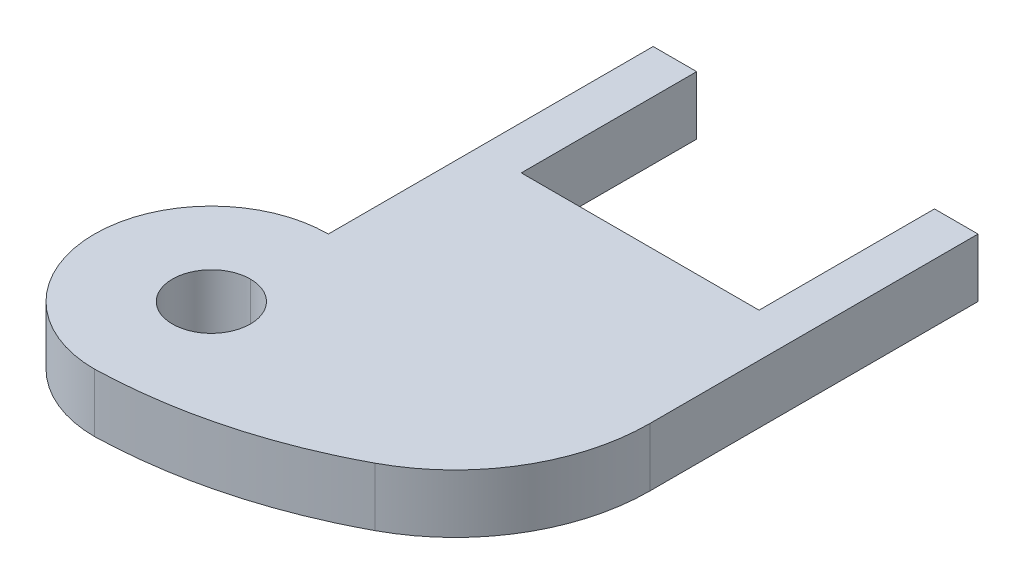
ISO-10303-21;
HEADER;
FILE_DESCRIPTION(('STEP AP214'),'2;1');
FILE_NAME('part.step','',(''),(''),'','','');
FILE_SCHEMA(('AUTOMOTIVE_DESIGN { 1 0 10303 214 1 1 1 1 }'));
ENDSEC;
DATA;
#1=APPLICATION_CONTEXT('core data for automotive mechanical design processes');
#2=APPLICATION_PROTOCOL_DEFINITION('international standard','automotive_design',2000,#1);
#3=PRODUCT_CONTEXT('',#1,'mechanical');
#4=PRODUCT('Part','Part','',(#3));
#5=PRODUCT_RELATED_PRODUCT_CATEGORY('part','',(#4));
#6=PRODUCT_DEFINITION_FORMATION('','',#4);
#7=PRODUCT_DEFINITION_CONTEXT('part definition',#1,'design');
#8=PRODUCT_DEFINITION('design','',#6,#7);
#9=PRODUCT_DEFINITION_SHAPE('','',#8);
#10=(LENGTH_UNIT() NAMED_UNIT(*) SI_UNIT(.MILLI.,.METRE.));
#11=(NAMED_UNIT(*) PLANE_ANGLE_UNIT() SI_UNIT($,.RADIAN.));
#12=(NAMED_UNIT(*) SI_UNIT($,.STERADIAN.) SOLID_ANGLE_UNIT());
#13=UNCERTAINTY_MEASURE_WITH_UNIT(LENGTH_MEASURE(1.E-05),#10,'distance_accuracy_value','');
#14=(GEOMETRIC_REPRESENTATION_CONTEXT(3) GLOBAL_UNCERTAINTY_ASSIGNED_CONTEXT((#13)) GLOBAL_UNIT_ASSIGNED_CONTEXT((#10,
#11,#12)) REPRESENTATION_CONTEXT('',''));
#15=CARTESIAN_POINT('',(0.,0.,0.));
#16=DIRECTION('',(0.,0.,1.));
#17=DIRECTION('',(1.,0.,0.));
#18=AXIS2_PLACEMENT_3D('',#15,#16,#17);
#19=CARTESIAN_POINT('',(6.66666666666666,1.5,16.828093270079));
#20=DIRECTION('',(0.,-1.,0.));
#21=DIRECTION('',(0.,0.,-1.));
#22=AXIS2_PLACEMENT_3D('',#19,#20,#21);
#23=CYLINDRICAL_SURFACE('',#22,10.);
#24=CARTESIAN_POINT('',(6.66666666666666,3.,16.828093270079));
#25=DIRECTION('',(0.,1.,0.));
#26=DIRECTION('',(0.,0.,1.));
#27=AXIS2_PLACEMENT_3D('',#24,#25,#26);
#28=CIRCLE('',#27,10.);
#29=CARTESIAN_POINT('',(11.3839103321823,3.,25.6455539136062));
#30=VERTEX_POINT('',#29);
#31=CARTESIAN_POINT('',(16.6666666666667,3.,16.828093270079));
#32=VERTEX_POINT('',#31);
#33=EDGE_CURVE('E60',#30,#32,#28,.T.);
#34=ORIENTED_EDGE('',*,*,#33,.F.);
#35=DIRECTION('',(0.,1.,0.));
#36=VECTOR('',#35,1.);
#37=CARTESIAN_POINT('',(11.3839103321823,0.,25.6455539136062));
#38=LINE('',#37,#36);
#39=CARTESIAN_POINT('',(11.3839103321823,0.,25.6455539136062));
#40=VERTEX_POINT('',#39);
#41=EDGE_CURVE('E236',#40,#30,#38,.T.);
#42=ORIENTED_EDGE('',*,*,#41,.F.);
#43=CARTESIAN_POINT('',(6.66666666666666,0.,16.828093270079));
#44=DIRECTION('',(0.,-1.,0.));
#45=DIRECTION('',(0.,0.,1.));
#46=AXIS2_PLACEMENT_3D('',#43,#44,#45);
#47=CIRCLE('',#46,10.);
#48=CARTESIAN_POINT('',(16.6666666666667,0.,16.828093270079));
#49=VERTEX_POINT('',#48);
#50=EDGE_CURVE('E11',#49,#40,#47,.T.);
#51=ORIENTED_EDGE('',*,*,#50,.F.);
#52=DIRECTION('',(0.,-1.,0.));
#53=VECTOR('',#52,1.);
#54=CARTESIAN_POINT('',(16.6666666666667,0.,16.828093270079));
#55=LINE('',#54,#53);
#56=EDGE_CURVE('E235',#32,#49,#55,.T.);
#57=ORIENTED_EDGE('',*,*,#56,.F.);
#58=EDGE_LOOP('',(#34,#42,#51,#57));
#59=FACE_BOUND('',#58,.T.);
#60=ADVANCED_FACE('F52',(#59),#23,.T.);
#61=CARTESIAN_POINT('',(0.,0.,0.));
#62=DIRECTION('',(0.,1.,0.));
#63=DIRECTION('',(1.,0.,0.));
#64=AXIS2_PLACEMENT_3D('',#61,#62,#63);
#65=PLANE('',#64);
#66=CARTESIAN_POINT('',(0.,0.,22.6666666666667));
#67=DIRECTION('',(0.,1.,0.));
#68=DIRECTION('',(0.,0.,1.));
#69=AXIS2_PLACEMENT_3D('',#66,#67,#68);
#70=CIRCLE('',#69,2.);
#71=CARTESIAN_POINT('',(0.,0.,20.6666666666667));
#72=VERTEX_POINT('',#71);
#73=CARTESIAN_POINT('',(0.,0.,24.6666666666667));
#74=VERTEX_POINT('',#73);
#75=EDGE_CURVE('E202',#72,#74,#70,.T.);
#76=ORIENTED_EDGE('',*,*,#75,.T.);
#77=CARTESIAN_POINT('',(0.,0.,22.6666666666667));
#78=DIRECTION('',(0.,1.,0.));
#79=DIRECTION('',(0.,0.,1.));
#80=AXIS2_PLACEMENT_3D('',#77,#78,#79);
#81=CIRCLE('',#80,2.);
#82=EDGE_CURVE('E293',#74,#72,#81,.T.);
#83=ORIENTED_EDGE('',*,*,#82,.T.);
#84=EDGE_LOOP('',(#76,#83));
#85=FACE_BOUND('',#84,.T.);
#86=DIRECTION('',(1.,0.,0.));
#87=VECTOR('',#86,1.);
#88=CARTESIAN_POINT('',(14.4333333333333,0.,9.));
#89=LINE('',#88,#87);
#90=CARTESIAN_POINT('',(2.23333333333334,0.,9.));
#91=VERTEX_POINT('',#90);
#92=CARTESIAN_POINT('',(14.4333333333333,0.,9.));
#93=VERTEX_POINT('',#92);
#94=EDGE_CURVE('E175',#91,#93,#89,.T.);
#95=ORIENTED_EDGE('',*,*,#94,.T.);
#96=DIRECTION('',(0.,0.,1.));
#97=VECTOR('',#96,1.);
#98=CARTESIAN_POINT('',(14.4333333333333,0.,0.));
#99=LINE('',#98,#97);
#100=CARTESIAN_POINT('',(14.4333333333333,0.,0.));
#101=VERTEX_POINT('',#100);
#102=EDGE_CURVE('E274',#101,#93,#99,.T.);
#103=ORIENTED_EDGE('',*,*,#102,.F.);
#104=DIRECTION('',(1.,0.,0.));
#105=VECTOR('',#104,1.);
#106=CARTESIAN_POINT('',(0.,0.,0.));
#107=LINE('',#106,#105);
#108=CARTESIAN_POINT('',(16.6666666666667,0.,0.));
#109=VERTEX_POINT('',#108);
#110=EDGE_CURVE('E258',#101,#109,#107,.T.);
#111=ORIENTED_EDGE('',*,*,#110,.T.);
#112=DIRECTION('',(0.,0.,1.));
#113=VECTOR('',#112,1.);
#114=CARTESIAN_POINT('',(16.6666666666667,0.,0.));
#115=LINE('',#114,#113);
#116=EDGE_CURVE('E238',#109,#49,#115,.T.);
#117=ORIENTED_EDGE('',*,*,#116,.T.);
#118=ORIENTED_EDGE('',*,*,#50,.T.);
#119=CARTESIAN_POINT('',(0.,0.,28.6666666666667));
#120=CARTESIAN_POINT('',(6.07420383109734,0.,28.4861880111768));
#121=CARTESIAN_POINT('',(11.3839103321823,0.,25.6455539136062));
#122=(BOUNDED_CURVE() B_SPLINE_CURVE(2,(#119,#120,#121),.UNSPECIFIED.,.F.,
.F.) B_SPLINE_CURVE_WITH_KNOTS((3,3),(0.,0.659334559030273),
.UNSPECIFIED.) CURVE() GEOMETRIC_REPRESENTATION_ITEM() RATIONAL_B_SPLINE_CURVE((1.,1.,1.)) REPRESENTATION_ITEM(''));
#123=CARTESIAN_POINT('',(0.,0.,28.6666666666667));
#124=VERTEX_POINT('',#123);
#125=EDGE_CURVE('E222',#124,#40,#122,.T.);
#126=ORIENTED_EDGE('',*,*,#125,.F.);
#127=CARTESIAN_POINT('',(0.,0.,22.6666666666667));
#128=DIRECTION('',(0.,1.,0.));
#129=DIRECTION('',(0.,0.,1.));
#130=AXIS2_PLACEMENT_3D('',#127,#128,#129);
#131=CIRCLE('',#130,6.);
#132=CARTESIAN_POINT('',(0.,0.,16.6666666666667));
#133=VERTEX_POINT('',#132);
#134=EDGE_CURVE('E198',#133,#124,#131,.T.);
#135=ORIENTED_EDGE('',*,*,#134,.F.);
#136=DIRECTION('',(0.,0.,1.));
#137=VECTOR('',#136,1.);
#138=CARTESIAN_POINT('',(0.,0.,0.));
#139=LINE('',#138,#137);
#140=CARTESIAN_POINT('',(0.,0.,0.));
#141=VERTEX_POINT('',#140);
#142=EDGE_CURVE('E300',#141,#133,#139,.T.);
#143=ORIENTED_EDGE('',*,*,#142,.F.);
#144=DIRECTION('',(1.,0.,0.));
#145=VECTOR('',#144,1.);
#146=CARTESIAN_POINT('',(0.,0.,0.));
#147=LINE('',#146,#145);
#148=CARTESIAN_POINT('',(2.23333333333334,0.,0.));
#149=VERTEX_POINT('',#148);
#150=EDGE_CURVE('E174',#141,#149,#147,.T.);
#151=ORIENTED_EDGE('',*,*,#150,.T.);
#152=DIRECTION('',(0.,0.,1.));
#153=VECTOR('',#152,1.);
#154=CARTESIAN_POINT('',(2.23333333333334,0.,0.));
#155=LINE('',#154,#153);
#156=EDGE_CURVE('E170',#149,#91,#155,.T.);
#157=ORIENTED_EDGE('',*,*,#156,.T.);
#158=EDGE_LOOP('',(#95,#103,#111,#117,#118,#126,#135,#143,#151,#157));
#159=FACE_BOUND('',#158,.T.);
#160=ADVANCED_FACE('F169',(#85,#159),#65,.F.);
#161=CARTESIAN_POINT('',(0.,3.,0.));
#162=DIRECTION('',(0.,1.,0.));
#163=DIRECTION('',(1.,0.,0.));
#164=AXIS2_PLACEMENT_3D('',#161,#162,#163);
#165=PLANE('',#164);
#166=DIRECTION('',(1.,0.,0.));
#167=VECTOR('',#166,1.);
#168=CARTESIAN_POINT('',(14.4333333333333,3.,9.));
#169=LINE('',#168,#167);
#170=CARTESIAN_POINT('',(2.23333333333334,3.,9.));
#171=VERTEX_POINT('',#170);
#172=CARTESIAN_POINT('',(14.4333333333333,3.,9.));
#173=VERTEX_POINT('',#172);
#174=EDGE_CURVE('E189',#171,#173,#169,.T.);
#175=ORIENTED_EDGE('',*,*,#174,.F.);
#176=DIRECTION('',(0.,0.,1.));
#177=VECTOR('',#176,1.);
#178=CARTESIAN_POINT('',(2.23333333333334,3.,0.));
#179=LINE('',#178,#177);
#180=CARTESIAN_POINT('',(2.23333333333334,3.,0.));
#181=VERTEX_POINT('',#180);
#182=EDGE_CURVE('E68',#181,#171,#179,.T.);
#183=ORIENTED_EDGE('',*,*,#182,.F.);
#184=DIRECTION('',(1.,0.,0.));
#185=VECTOR('',#184,1.);
#186=CARTESIAN_POINT('',(0.,3.,0.));
#187=LINE('',#186,#185);
#188=CARTESIAN_POINT('',(0.,3.,0.));
#189=VERTEX_POINT('',#188);
#190=EDGE_CURVE('E286',#189,#181,#187,.T.);
#191=ORIENTED_EDGE('',*,*,#190,.F.);
#192=DIRECTION('',(0.,0.,1.));
#193=VECTOR('',#192,1.);
#194=CARTESIAN_POINT('',(0.,3.,0.));
#195=LINE('',#194,#193);
#196=CARTESIAN_POINT('',(0.,3.,16.6666666666667));
#197=VERTEX_POINT('',#196);
#198=EDGE_CURVE('E81',#189,#197,#195,.T.);
#199=ORIENTED_EDGE('',*,*,#198,.T.);
#200=CARTESIAN_POINT('',(0.,3.,22.6666666666667));
#201=DIRECTION('',(0.,1.,0.));
#202=DIRECTION('',(0.,0.,1.));
#203=AXIS2_PLACEMENT_3D('',#200,#201,#202);
#204=CIRCLE('',#203,6.);
#205=CARTESIAN_POINT('',(0.,3.,28.6666666666667));
#206=VERTEX_POINT('',#205);
#207=EDGE_CURVE('E219',#197,#206,#204,.T.);
#208=ORIENTED_EDGE('',*,*,#207,.T.);
#209=CARTESIAN_POINT('',(0.,3.,28.6666666666667));
#210=CARTESIAN_POINT('',(6.07420383109734,3.,28.4861880111768));
#211=CARTESIAN_POINT('',(11.3839103321823,3.,25.6455539136062));
#212=(BOUNDED_CURVE() B_SPLINE_CURVE(2,(#209,#210,#211),.UNSPECIFIED.,.F.,
.F.) B_SPLINE_CURVE_WITH_KNOTS((3,3),(0.,0.659334559030273),
.UNSPECIFIED.) CURVE() GEOMETRIC_REPRESENTATION_ITEM() RATIONAL_B_SPLINE_CURVE((1.,1.,1.)) REPRESENTATION_ITEM(''));
#213=EDGE_CURVE('E232',#206,#30,#212,.T.);
#214=ORIENTED_EDGE('',*,*,#213,.T.);
#215=ORIENTED_EDGE('',*,*,#33,.T.);
#216=DIRECTION('',(0.,0.,1.));
#217=VECTOR('',#216,1.);
#218=CARTESIAN_POINT('',(16.6666666666667,3.,0.));
#219=LINE('',#218,#217);
#220=CARTESIAN_POINT('',(16.6666666666667,3.,0.));
#221=VERTEX_POINT('',#220);
#222=EDGE_CURVE('E228',#221,#32,#219,.T.);
#223=ORIENTED_EDGE('',*,*,#222,.F.);
#224=DIRECTION('',(1.,0.,0.));
#225=VECTOR('',#224,1.);
#226=CARTESIAN_POINT('',(0.,3.,0.));
#227=LINE('',#226,#225);
#228=CARTESIAN_POINT('',(14.4333333333333,3.,0.));
#229=VERTEX_POINT('',#228);
#230=EDGE_CURVE('E275',#229,#221,#227,.T.);
#231=ORIENTED_EDGE('',*,*,#230,.F.);
#232=DIRECTION('',(0.,0.,1.));
#233=VECTOR('',#232,1.);
#234=CARTESIAN_POINT('',(14.4333333333333,3.,0.));
#235=LINE('',#234,#233);
#236=EDGE_CURVE('E178',#229,#173,#235,.T.);
#237=ORIENTED_EDGE('',*,*,#236,.T.);
#238=EDGE_LOOP('',(#175,#183,#191,#199,#208,#214,#215,#223,#231,#237));
#239=FACE_BOUND('',#238,.T.);
#240=CARTESIAN_POINT('',(0.,3.,22.6666666666667));
#241=DIRECTION('',(0.,1.,0.));
#242=DIRECTION('',(0.,0.,1.));
#243=AXIS2_PLACEMENT_3D('',#240,#241,#242);
#244=CIRCLE('',#243,2.);
#245=CARTESIAN_POINT('',(0.,3.,20.6666666666667));
#246=VERTEX_POINT('',#245);
#247=CARTESIAN_POINT('',(0.,3.,24.6666666666667));
#248=VERTEX_POINT('',#247);
#249=EDGE_CURVE('E191',#246,#248,#244,.T.);
#250=ORIENTED_EDGE('',*,*,#249,.F.);
#251=CARTESIAN_POINT('',(0.,3.,22.6666666666667));
#252=DIRECTION('',(0.,1.,0.));
#253=DIRECTION('',(0.,0.,1.));
#254=AXIS2_PLACEMENT_3D('',#251,#252,#253);
#255=CIRCLE('',#254,2.);
#256=EDGE_CURVE('E295',#248,#246,#255,.T.);
#257=ORIENTED_EDGE('',*,*,#256,.F.);
#258=EDGE_LOOP('',(#250,#257));
#259=FACE_BOUND('',#258,.T.);
#260=ADVANCED_FACE('F54',(#239,#259),#165,.T.);
#261=CARTESIAN_POINT('',(0.,3.,0.));
#262=DIRECTION('',(1.,0.,0.));
#263=DIRECTION('',(0.,1.,0.));
#264=AXIS2_PLACEMENT_3D('',#261,#262,#263);
#265=PLANE('',#264);
#266=ORIENTED_EDGE('',*,*,#142,.T.);
#267=DIRECTION('',(0.,-1.,0.));
#268=VECTOR('',#267,1.);
#269=CARTESIAN_POINT('',(0.,3.,16.6666666666667));
#270=LINE('',#269,#268);
#271=EDGE_CURVE('E217',#197,#133,#270,.T.);
#272=ORIENTED_EDGE('',*,*,#271,.F.);
#273=ORIENTED_EDGE('',*,*,#198,.F.);
#274=DIRECTION('',(0.,-1.,0.));
#275=VECTOR('',#274,1.);
#276=CARTESIAN_POINT('',(0.,3.,0.));
#277=LINE('',#276,#275);
#278=EDGE_CURVE('E287',#189,#141,#277,.T.);
#279=ORIENTED_EDGE('',*,*,#278,.T.);
#280=EDGE_LOOP('',(#266,#272,#273,#279));
#281=FACE_BOUND('',#280,.T.);
#282=ADVANCED_FACE('F334',(#281),#265,.F.);
#283=CARTESIAN_POINT('',(0.,3.,22.6666666666667));
#284=DIRECTION('',(0.,-1.,0.));
#285=DIRECTION('',(0.,0.,-1.));
#286=AXIS2_PLACEMENT_3D('',#283,#284,#285);
#287=CYLINDRICAL_SURFACE('',#286,2.);
#288=DIRECTION('',(0.,-1.,0.));
#289=VECTOR('',#288,1.);
#290=CARTESIAN_POINT('',(0.,3.,24.6666666666667));
#291=LINE('',#290,#289);
#292=EDGE_CURVE('E203',#248,#74,#291,.T.);
#293=ORIENTED_EDGE('',*,*,#292,.F.);
#294=ORIENTED_EDGE('',*,*,#256,.T.);
#295=DIRECTION('',(0.,-1.,0.));
#296=VECTOR('',#295,1.);
#297=CARTESIAN_POINT('',(0.,3.,20.6666666666667));
#298=LINE('',#297,#296);
#299=EDGE_CURVE('E197',#246,#72,#298,.T.);
#300=ORIENTED_EDGE('',*,*,#299,.T.);
#301=ORIENTED_EDGE('',*,*,#82,.F.);
#302=EDGE_LOOP('',(#293,#294,#300,#301));
#303=FACE_BOUND('',#302,.T.);
#304=ADVANCED_FACE('F337',(#303),#287,.F.);
#305=CARTESIAN_POINT('',(0.,3.,0.));
#306=DIRECTION('',(0.,0.,-1.));
#307=DIRECTION('',(0.,-1.,0.));
#308=AXIS2_PLACEMENT_3D('',#305,#306,#307);
#309=PLANE('',#308);
#310=ORIENTED_EDGE('',*,*,#150,.F.);
#311=ORIENTED_EDGE('',*,*,#278,.F.);
#312=ORIENTED_EDGE('',*,*,#190,.T.);
#313=DIRECTION('',(0.,-1.,0.));
#314=VECTOR('',#313,1.);
#315=CARTESIAN_POINT('',(2.23333333333334,3.,0.));
#316=LINE('',#315,#314);
#317=EDGE_CURVE('E180',#181,#149,#316,.T.);
#318=ORIENTED_EDGE('',*,*,#317,.T.);
#319=EDGE_LOOP('',(#310,#311,#312,#318));
#320=FACE_BOUND('',#319,.T.);
#321=ADVANCED_FACE('F331',(#320),#309,.T.);
#322=CARTESIAN_POINT('',(2.23333333333334,3.,0.));
#323=DIRECTION('',(1.,0.,0.));
#324=DIRECTION('',(0.,1.,0.));
#325=AXIS2_PLACEMENT_3D('',#322,#323,#324);
#326=PLANE('',#325);
#327=ORIENTED_EDGE('',*,*,#156,.F.);
#328=ORIENTED_EDGE('',*,*,#317,.F.);
#329=ORIENTED_EDGE('',*,*,#182,.T.);
#330=DIRECTION('',(0.,1.,0.));
#331=VECTOR('',#330,1.);
#332=CARTESIAN_POINT('',(2.23333333333334,0.,9.));
#333=LINE('',#332,#331);
#334=EDGE_CURVE('E179',#91,#171,#333,.T.);
#335=ORIENTED_EDGE('',*,*,#334,.F.);
#336=EDGE_LOOP('',(#327,#328,#329,#335));
#337=FACE_BOUND('',#336,.T.);
#338=ADVANCED_FACE('F181',(#337),#326,.T.);
#339=CARTESIAN_POINT('',(14.4333333333333,3.,0.));
#340=DIRECTION('',(1.,0.,0.));
#341=DIRECTION('',(0.,1.,0.));
#342=AXIS2_PLACEMENT_3D('',#339,#340,#341);
#343=PLANE('',#342);
#344=ORIENTED_EDGE('',*,*,#102,.T.);
#345=DIRECTION('',(0.,1.,0.));
#346=VECTOR('',#345,1.);
#347=CARTESIAN_POINT('',(14.4333333333333,0.,9.));
#348=LINE('',#347,#346);
#349=EDGE_CURVE('E184',#93,#173,#348,.T.);
#350=ORIENTED_EDGE('',*,*,#349,.T.);
#351=ORIENTED_EDGE('',*,*,#236,.F.);
#352=DIRECTION('',(0.,-1.,0.));
#353=VECTOR('',#352,1.);
#354=CARTESIAN_POINT('',(14.4333333333333,3.,0.));
#355=LINE('',#354,#353);
#356=EDGE_CURVE('E263',#229,#101,#355,.T.);
#357=ORIENTED_EDGE('',*,*,#356,.T.);
#358=EDGE_LOOP('',(#344,#350,#351,#357));
#359=FACE_BOUND('',#358,.T.);
#360=ADVANCED_FACE('F322',(#359),#343,.F.);
#361=CARTESIAN_POINT('',(0.,3.,0.));
#362=DIRECTION('',(0.,0.,-1.));
#363=DIRECTION('',(0.,-1.,0.));
#364=AXIS2_PLACEMENT_3D('',#361,#362,#363);
#365=PLANE('',#364);
#366=ORIENTED_EDGE('',*,*,#110,.F.);
#367=ORIENTED_EDGE('',*,*,#356,.F.);
#368=ORIENTED_EDGE('',*,*,#230,.T.);
#369=DIRECTION('',(0.,-1.,0.));
#370=VECTOR('',#369,1.);
#371=CARTESIAN_POINT('',(16.6666666666667,3.,0.));
#372=LINE('',#371,#370);
#373=EDGE_CURVE('E250',#221,#109,#372,.T.);
#374=ORIENTED_EDGE('',*,*,#373,.T.);
#375=EDGE_LOOP('',(#366,#367,#368,#374));
#376=FACE_BOUND('',#375,.T.);
#377=ADVANCED_FACE('F319',(#376),#365,.T.);
#378=CARTESIAN_POINT('',(16.6666666666667,3.,0.));
#379=DIRECTION('',(1.,0.,0.));
#380=DIRECTION('',(0.,1.,0.));
#381=AXIS2_PLACEMENT_3D('',#378,#379,#380);
#382=PLANE('',#381);
#383=ORIENTED_EDGE('',*,*,#222,.T.);
#384=ORIENTED_EDGE('',*,*,#56,.T.);
#385=ORIENTED_EDGE('',*,*,#116,.F.);
#386=ORIENTED_EDGE('',*,*,#373,.F.);
#387=EDGE_LOOP('',(#383,#384,#385,#386));
#388=FACE_BOUND('',#387,.T.);
#389=ADVANCED_FACE('F320',(#388),#382,.T.);
#390=CARTESIAN_POINT('',(0.,3.,28.6666666666667));
#391=CARTESIAN_POINT('',(0.,0.,28.6666666666667));
#392=CARTESIAN_POINT('',(6.07420383109734,3.,28.4861880111768));
#393=CARTESIAN_POINT('',(6.07420383109734,0.,28.4861880111768));
#394=CARTESIAN_POINT('',(11.3839103321823,3.,25.6455539136062));
#395=CARTESIAN_POINT('',(11.3839103321823,0.,25.6455539136062));
#396=(BOUNDED_SURFACE() B_SPLINE_SURFACE(2,1,((#390,#391),(#392,#393),(#394,#395)),
.UNSPECIFIED.,.F.,.F.,.F.) B_SPLINE_SURFACE_WITH_KNOTS((3,3),(2,2),(0.,0.659334559030273),(0.,
1.),.UNSPECIFIED.) GEOMETRIC_REPRESENTATION_ITEM() RATIONAL_B_SPLINE_SURFACE(((1.,1.),(1.,1.),
(1.,1.))) REPRESENTATION_ITEM('') SURFACE());
#397=DIRECTION('',(0.,-1.,0.));
#398=VECTOR('',#397,1.);
#399=CARTESIAN_POINT('',(0.,3.,28.6666666666667));
#400=LINE('',#399,#398);
#401=EDGE_CURVE('E214',#206,#124,#400,.T.);
#402=ORIENTED_EDGE('',*,*,#125,.T.);
#403=ORIENTED_EDGE('',*,*,#41,.T.);
#404=ORIENTED_EDGE('',*,*,#213,.F.);
#405=ORIENTED_EDGE('',*,*,#401,.T.);
#406=EDGE_LOOP('',(#402,#403,#404,#405));
#407=FACE_BOUND('',#406,.T.);
#408=ADVANCED_FACE('F327',(#407),#396,.F.);
#409=CARTESIAN_POINT('',(0.,3.,22.6666666666667));
#410=DIRECTION('',(0.,-1.,0.));
#411=DIRECTION('',(0.,0.,-1.));
#412=AXIS2_PLACEMENT_3D('',#409,#410,#411);
#413=CYLINDRICAL_SURFACE('',#412,6.);
#414=ORIENTED_EDGE('',*,*,#134,.T.);
#415=ORIENTED_EDGE('',*,*,#401,.F.);
#416=ORIENTED_EDGE('',*,*,#207,.F.);
#417=ORIENTED_EDGE('',*,*,#271,.T.);
#418=EDGE_LOOP('',(#414,#415,#416,#417));
#419=FACE_BOUND('',#418,.T.);
#420=ADVANCED_FACE('F328',(#419),#413,.T.);
#421=CARTESIAN_POINT('',(0.,3.,22.6666666666667));
#422=DIRECTION('',(0.,-1.,0.));
#423=DIRECTION('',(0.,0.,-1.));
#424=AXIS2_PLACEMENT_3D('',#421,#422,#423);
#425=CYLINDRICAL_SURFACE('',#424,2.);
#426=ORIENTED_EDGE('',*,*,#249,.T.);
#427=ORIENTED_EDGE('',*,*,#292,.T.);
#428=ORIENTED_EDGE('',*,*,#75,.F.);
#429=ORIENTED_EDGE('',*,*,#299,.F.);
#430=EDGE_LOOP('',(#426,#427,#428,#429));
#431=FACE_BOUND('',#430,.T.);
#432=ADVANCED_FACE('F358',(#431),#425,.F.);
#433=CARTESIAN_POINT('',(14.4333333333333,0.,9.));
#434=DIRECTION('',(0.,0.,1.));
#435=DIRECTION('',(1.,0.,0.));
#436=AXIS2_PLACEMENT_3D('',#433,#434,#435);
#437=PLANE('',#436);
#438=ORIENTED_EDGE('',*,*,#174,.T.);
#439=ORIENTED_EDGE('',*,*,#349,.F.);
#440=ORIENTED_EDGE('',*,*,#94,.F.);
#441=ORIENTED_EDGE('',*,*,#334,.T.);
#442=EDGE_LOOP('',(#438,#439,#440,#441));
#443=FACE_BOUND('',#442,.T.);
#444=ADVANCED_FACE('F187',(#443),#437,.F.);
#445=CLOSED_SHELL('',(#60,#160,#260,#282,#304,#321,#338,#360,#377,#389,#408,#420,#432,#444));
#446=MANIFOLD_SOLID_BREP('B2',#445);
#447=ADVANCED_BREP_SHAPE_REPRESENTATION('',(#18,#446),#14);
#448=SHAPE_DEFINITION_REPRESENTATION(#9,#447);
ENDSEC;
END-ISO-10303-21;
